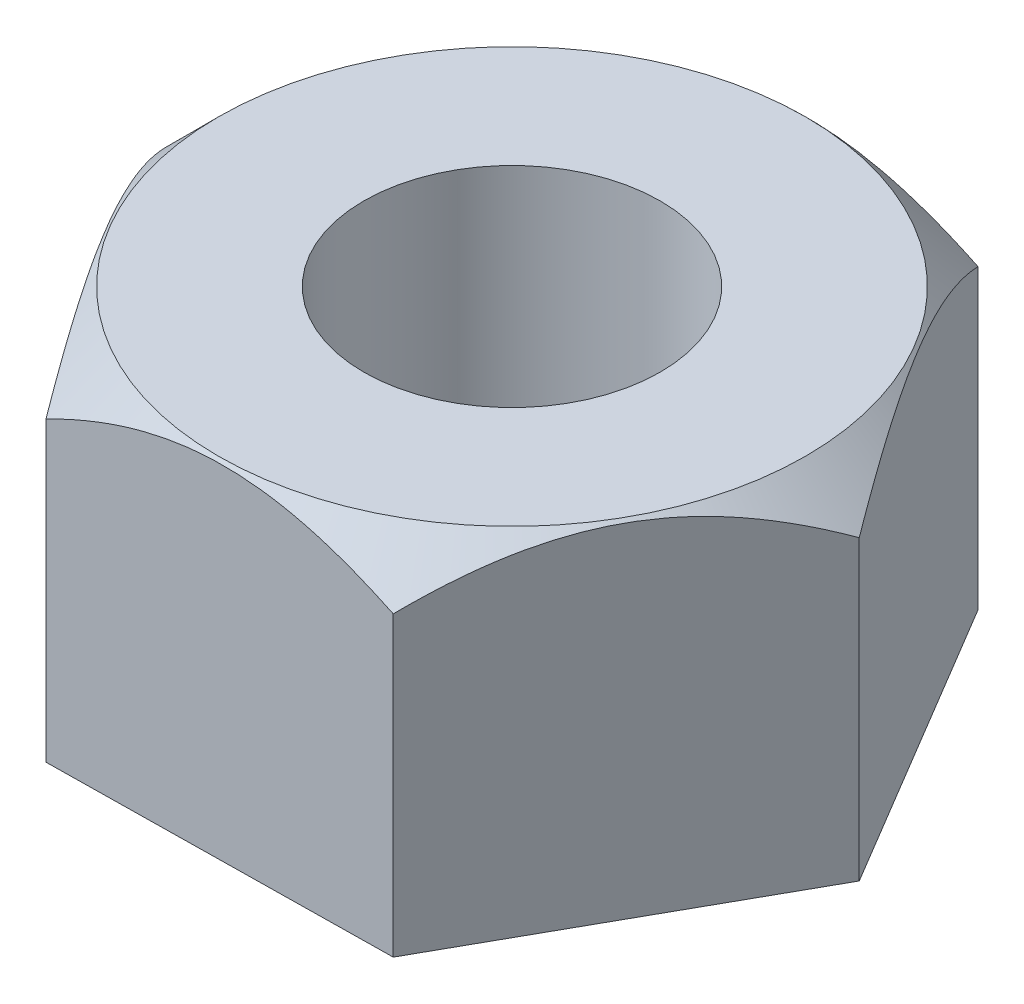
ISO-10303-21;
HEADER;
FILE_DESCRIPTION(('STEP AP214'),'2;1');
FILE_NAME('part.step','',(''),(''),'','','');
FILE_SCHEMA(('AUTOMOTIVE_DESIGN { 1 0 10303 214 1 1 1 1 }'));
ENDSEC;
DATA;
#1=APPLICATION_CONTEXT('core data for automotive mechanical design processes');
#2=APPLICATION_PROTOCOL_DEFINITION('international standard','automotive_design',2000,#1);
#3=PRODUCT_CONTEXT('',#1,'mechanical');
#4=PRODUCT('Part','Part','',(#3));
#5=PRODUCT_RELATED_PRODUCT_CATEGORY('part','',(#4));
#6=PRODUCT_DEFINITION_FORMATION('','',#4);
#7=PRODUCT_DEFINITION_CONTEXT('part definition',#1,'design');
#8=PRODUCT_DEFINITION('design','',#6,#7);
#9=PRODUCT_DEFINITION_SHAPE('','',#8);
#10=(LENGTH_UNIT() NAMED_UNIT(*) SI_UNIT(.MILLI.,.METRE.));
#11=(NAMED_UNIT(*) PLANE_ANGLE_UNIT() SI_UNIT($,.RADIAN.));
#12=(NAMED_UNIT(*) SI_UNIT($,.STERADIAN.) SOLID_ANGLE_UNIT());
#13=UNCERTAINTY_MEASURE_WITH_UNIT(LENGTH_MEASURE(1.E-05),#10,'distance_accuracy_value','');
#14=(GEOMETRIC_REPRESENTATION_CONTEXT(3) GLOBAL_UNCERTAINTY_ASSIGNED_CONTEXT((#13)) GLOBAL_UNIT_ASSIGNED_CONTEXT((#10,
#11,#12)) REPRESENTATION_CONTEXT('',''));
#15=CARTESIAN_POINT('',(0.,0.,0.));
#16=DIRECTION('',(0.,0.,1.));
#17=DIRECTION('',(1.,0.,0.));
#18=AXIS2_PLACEMENT_3D('',#15,#16,#17);
#19=CARTESIAN_POINT('',(-16.8965263921017,35.,30.2408233333851));
#20=DIRECTION('',(-0.0140755274986021,0.,-0.999900934855867));
#21=DIRECTION('',(-0.999900934855867,0.,0.0140755274986021));
#22=AXIS2_PLACEMENT_3D('',#19,#20,#21);
#23=PLANE('',#22);
#24=CARTESIAN_POINT('',(-16.8967263921017,30.0733528128783,30.2408261487695));
#25=CARTESIAN_POINT('',(-16.3012417337254,30.3710758383275,30.232443557663));
#26=CARTESIAN_POINT('',(-15.7010934883612,30.6597137270277,30.223995317606));
#27=CARTESIAN_POINT('',(-14.490744090219,31.2159334632379,30.2069573234982));
#28=CARTESIAN_POINT('',(-13.8805376643465,31.4835038119446,30.1983674952184));
#29=CARTESIAN_POINT('',(-12.6464682975278,31.9958357626679,30.180995596961));
#30=CARTESIAN_POINT('',(-12.0225471711405,32.2404580078834,30.1722127079114));
#31=CARTESIAN_POINT('',(-10.7644571516311,32.7015808484031,30.1545026727989));
#32=CARTESIAN_POINT('',(-10.1302898418968,32.9180857429419,30.1455755490252));
#33=CARTESIAN_POINT('',(-8.86195465153599,33.3161089993481,30.1277212934414));
#34=CARTESIAN_POINT('',(-8.22794336138656,33.4981236592763,30.1187963659433));
#35=CARTESIAN_POINT('',(-6.95092803981943,33.8276716741696,30.1008199208293));
#36=CARTESIAN_POINT('',(-6.30792356841713,33.9752033357815,30.0917683970198));
#37=CARTESIAN_POINT('',(-5.01584802272401,34.2320314171853,30.073579950305));
#38=CARTESIAN_POINT('',(-4.36679474528391,34.341416831023,30.0644432779246));
#39=CARTESIAN_POINT('',(-3.06315785900884,34.5195373561074,30.0460920831199));
#40=CARTESIAN_POINT('',(-2.40857509130723,34.5882785410107,30.0368775725362));
#41=CARTESIAN_POINT('',(-1.28298779414934,34.6696879114061,30.0210327679151));
#42=CARTESIAN_POINT('',(-0.812712187945846,34.6927426751118,30.0144127348735));
#43=CARTESIAN_POINT('',(0.128397389459291,34.7167164807198,30.0011648087299));
#44=CARTESIAN_POINT('',(0.599231333594301,34.7176365550372,29.9945369160088));
#45=CARTESIAN_POINT('',(1.54058427040297,34.6973189156047,29.9812855641137));
#46=CARTESIAN_POINT('',(2.01110308942099,34.6760732502631,29.9746621073844));
#47=CARTESIAN_POINT('',(2.95064787602284,34.6117402166292,29.9614362086788));
#48=CARTESIAN_POINT('',(3.41967381787342,34.5686524738672,29.9548337670649));
#49=CARTESIAN_POINT('',(4.3557609588433,34.4612214348156,29.9416565413673));
#50=CARTESIAN_POINT('',(4.82281965994384,34.3968564591848,29.9350817924481));
#51=CARTESIAN_POINT('',(5.75372089477773,34.2477844601109,29.9219775683468));
#52=CARTESIAN_POINT('',(6.21756305460481,34.1630751112109,29.9154480984283));
#53=CARTESIAN_POINT('',(7.14120843511876,33.9744504559985,29.9024460144226));
#54=CARTESIAN_POINT('',(7.60101252010505,33.8705393699783,29.8959733881688));
#55=CARTESIAN_POINT('',(8.51619890415774,33.6447412072004,29.8830903807967));
#56=CARTESIAN_POINT('',(8.97158084290303,33.5228526785055,29.8766800047507));
#57=CARTESIAN_POINT('',(10.1439451532646,33.1858305907987,29.8601767237619));
#58=CARTESIAN_POINT('',(10.8573023240414,32.9580113062111,29.8501348504887));
#59=CARTESIAN_POINT('',(12.2711298373565,32.4656876184971,29.8302325108186));
#60=CARTESIAN_POINT('',(12.9715997902385,32.201182108189,29.8203720499069));
#61=CARTESIAN_POINT('',(14.3575804559041,31.6413578284551,29.80086170814));
#62=CARTESIAN_POINT('',(15.0431304313584,31.3461359651212,29.7912112745872));
#63=CARTESIAN_POINT('',(16.0619796968487,30.8831568426234,29.7768690129156));
#64=CARTESIAN_POINT('',(16.399928522185,30.7255171939678,29.7721117336509));
#65=CARTESIAN_POINT('',(17.0728165784847,30.4039970834876,29.7626395409469));
#66=CARTESIAN_POINT('',(17.4077560250795,30.2401170732838,29.7579246244721));
#67=CARTESIAN_POINT('',(17.7412580420178,30.0733528128783,29.7532299425825));
#68=B_SPLINE_CURVE_WITH_KNOTS('',3,(#24,#25,#26,#27,#28,#29,#30,#31,#32,#33,#34,#35,#36,#37,#38,
#39,#40,#41,#42,#43,#44,#45,#46,#47,#48,#49,#50,#51,#52,#53,#54,#55,#56,#57,#58,#59,#60,#61,#62,
#63,#64,#65,#66,#67),.UNSPECIFIED.,.F.,.F.,(4,2,2,2,2,2,2,2,2,2,2,2,2,2,2,2,2,2,2,2,2,4),(0.,
1.99753332855272,3.99614947325625,6.00620823156275,8.01595928255441,9.99413044648933,
11.9723987318665,13.9460204068616,15.9193470797849,17.3315253047777,18.7436376622537,
20.1562567658751,21.5689000888557,22.9829872113905,24.3972360476788,25.8111744193603,
27.225227049503,29.4707461484645,31.7163330314216,33.9550386702232,35.0737986278815,
36.192477773146),.UNSPECIFIED.);
#69=CARTESIAN_POINT('',(-16.8965263921017,30.0734528232189,30.2408233333851));
#70=VERTEX_POINT('',#69);
#71=CARTESIAN_POINT('',(17.7410580420178,30.0734528232189,29.7532327579669));
#72=VERTEX_POINT('',#71);
#73=EDGE_CURVE('E91',#70,#72,#68,.T.);
#74=ORIENTED_EDGE('',*,*,#73,.F.);
#75=DIRECTION('',(0.,-1.,0.));
#76=VECTOR('',#75,1.);
#77=CARTESIAN_POINT('',(-16.8965263921017,35.,30.2408233333851));
#78=LINE('',#77,#76);
#79=CARTESIAN_POINT('',(-16.8965263921017,0.,30.2408233333851));
#80=VERTEX_POINT('',#79);
#81=EDGE_CURVE('E61',#70,#80,#78,.T.);
#82=ORIENTED_EDGE('',*,*,#81,.T.);
#83=DIRECTION('',(0.999900934855867,0.,-0.0140755274986021));
#84=VECTOR('',#83,1.);
#85=CARTESIAN_POINT('',(-16.8965263921017,0.,30.2408233333851));
#86=LINE('',#85,#84);
#87=CARTESIAN_POINT('',(17.7410580420178,0.,29.7532327579669));
#88=VERTEX_POINT('',#87);
#89=EDGE_CURVE('E131',#80,#88,#86,.T.);
#90=ORIENTED_EDGE('',*,*,#89,.T.);
#91=DIRECTION('',(0.,-1.,0.));
#92=VECTOR('',#91,1.);
#93=CARTESIAN_POINT('',(17.7410580420178,35.,29.7532327579669));
#94=LINE('',#93,#92);
#95=EDGE_CURVE('E12',#72,#88,#94,.T.);
#96=ORIENTED_EDGE('',*,*,#95,.F.);
#97=EDGE_LOOP('',(#74,#82,#90,#96));
#98=FACE_BOUND('',#97,.T.);
#99=ADVANCED_FACE('F38',(#98),#23,.F.);
#100=CARTESIAN_POINT('',(17.7410580420178,35.,29.7532327579669));
#101=DIRECTION('',(-0.872977374602291,0.,-0.487760703042478));
#102=DIRECTION('',(-0.487760703042478,0.,0.872977374602291));
#103=AXIS2_PLACEMENT_3D('',#100,#101,#102);
#104=PLANE('',#103);
#105=CARTESIAN_POINT('',(17.7409462955472,30.0733382721447,29.7534327579669));
#106=CARTESIAN_POINT('',(18.0314295154129,30.371062110346,29.2335358555255));
#107=CARTESIAN_POINT('',(18.3241876805629,30.6597008018401,28.7095673340521));
#108=CARTESIAN_POINT('',(18.9146079237605,31.2159221139609,27.6528534360204));
#109=CARTESIAN_POINT('',(19.2122725740859,31.4834932357338,27.1201034556875));
#110=CARTESIAN_POINT('',(19.8142636727009,31.9958267028122,26.042680437546));
#111=CARTESIAN_POINT('',(20.1186185046037,32.2404496903887,25.4979565997199));
#112=CARTESIAN_POINT('',(20.7323271395083,32.7015739572541,24.3995619370752));
#113=CARTESIAN_POINT('',(21.0416801701142,32.9180795357985,23.8458924946639));
#114=CARTESIAN_POINT('',(21.6603865021783,33.3161040613858,22.7385531250795));
#115=CARTESIAN_POINT('',(21.9696634167808,33.4981193096299,22.1850199124802));
#116=CARTESIAN_POINT('',(22.5926040053109,33.8276684122818,21.070102215921));
#117=CARTESIAN_POINT('',(22.9062678938688,33.9752005733252,20.5087173478231));
#118=CARTESIAN_POINT('',(23.536555027297,34.2320295421012,19.3806510572145));
#119=CARTESIAN_POINT('',(23.8531695906192,34.3414153445723,18.8139851726408));
#120=CARTESIAN_POINT('',(24.4890964765936,34.5195365208665,17.6758250463861));
#121=CARTESIAN_POINT('',(24.8084083889284,34.5882779684082,17.1043315390771));
#122=CARTESIAN_POINT('',(25.3574805856338,34.6696876160995,16.121620956291));
#123=CARTESIAN_POINT('',(25.586885291497,34.6927424629794,15.7110402830291));
#124=CARTESIAN_POINT('',(26.045967080578,34.7167164314874,14.8893914448596));
#125=CARTESIAN_POINT('',(26.2756441505922,34.717636585537,14.4783233035832));
#126=CARTESIAN_POINT('',(26.7348446564154,34.697319100869,13.6564619902607));
#127=CARTESIAN_POINT('',(26.964368007514,34.6760735105381,13.2456689698264));
#128=CARTESIAN_POINT('',(27.4226864848526,34.6117406211074,12.4253862808293));
#129=CARTESIAN_POINT('',(27.6514815985396,34.5686529475355,12.0158966347335));
#130=CARTESIAN_POINT('',(28.1081134094179,34.4612220399397,11.1986326835093));
#131=CARTESIAN_POINT('',(28.3359488880465,34.3968571264283,10.7908605593225));
#132=CARTESIAN_POINT('',(28.7900509706783,34.2477852441752,9.97812422893626));
#133=CARTESIAN_POINT('',(29.0163173922868,34.1630759499766,9.57316034918049));
#134=CARTESIAN_POINT('',(29.4668800050822,33.9744513964994,8.76675884049284));
#135=CARTESIAN_POINT('',(29.6911766178816,33.8705403575122,8.36532045697304));
#136=CARTESIAN_POINT('',(30.1376128566341,33.644742281236,7.56630419099986));
#137=CARTESIAN_POINT('',(30.3597523068183,33.5228537920017,7.16872662313144));
#138=CARTESIAN_POINT('',(30.9316436749823,33.185830973153,6.14517507003714));
#139=CARTESIAN_POINT('',(31.2796271640056,32.9580107448315,5.52236615829495));
#140=CARTESIAN_POINT('',(31.9693077801912,32.4656848808394,4.28799944962755));
#141=CARTESIAN_POINT('',(32.3110047172455,32.201178137811,3.6764419929513));
#142=CARTESIAN_POINT('',(32.9871012870056,31.6413511662024,2.46638754460143));
#143=CARTESIAN_POINT('',(33.3215200725022,31.3461278441646,1.86785627391992));
#144=CARTESIAN_POINT('',(33.8185258828883,30.8831464029996,0.97833232332985));
#145=CARTESIAN_POINT('',(33.983381010558,30.7255059607804,0.68328027086821));
#146=CARTESIAN_POINT('',(34.3116231476127,30.4039842243877,0.0958037536898502));
#147=CARTESIAN_POINT('',(34.4750102621866,30.2401033818427,-0.196620899290252));
#148=CARTESIAN_POINT('',(34.6376961805903,30.0733382721447,-0.487790575418247));
#149=B_SPLINE_CURVE_WITH_KNOTS('',3,(#105,#106,#107,#108,#109,#110,#111,#112,#113,#114,#115,
#116,#117,#118,#119,#120,#121,#122,#123,#124,#125,#126,#127,#128,#129,#130,#131,#132,#133,#134,
#135,#136,#137,#138,#139,#140,#141,#142,#143,#144,#145,#146,#147,#148),.UNSPECIFIED.,.F.,.F.,(4,
2,2,2,2,2,2,2,2,2,2,2,2,2,2,2,2,2,2,2,2,4),(0.,1.99753677134283,3.99615636389893,
6.00621864636324,8.01597322012988,9.99414772625386,11.972419354385,13.9460443414354,
15.9193743238228,17.3315526812136,18.7436651706898,20.1562844076223,21.5689278640544,
22.9830151294544,24.3972641085643,25.8112026232287,27.2252553969619,29.4707836670239,
31.7163797316034,33.9550945415454,35.0738590707961,36.1925427864669),.UNSPECIFIED.);
#150=CARTESIAN_POINT('',(34.6375844341196,30.0734528232189,-0.487590575418245));
#151=VERTEX_POINT('',#150);
#152=EDGE_CURVE('E99',#72,#151,#149,.T.);
#153=ORIENTED_EDGE('',*,*,#152,.F.);
#154=ORIENTED_EDGE('',*,*,#95,.T.);
#155=DIRECTION('',(0.487760703042478,0.,-0.872977374602291));
#156=VECTOR('',#155,1.);
#157=CARTESIAN_POINT('',(17.7410580420178,0.,29.7532327579669));
#158=LINE('',#157,#156);
#159=CARTESIAN_POINT('',(34.6375844341196,0.,-0.487590575418245));
#160=VERTEX_POINT('',#159);
#161=EDGE_CURVE('E128',#88,#160,#158,.T.);
#162=ORIENTED_EDGE('',*,*,#161,.T.);
#163=DIRECTION('',(0.,-1.,0.));
#164=VECTOR('',#163,1.);
#165=CARTESIAN_POINT('',(34.6375844341196,35.,-0.487590575418245));
#166=LINE('',#165,#164);
#167=EDGE_CURVE('E46',#151,#160,#166,.T.);
#168=ORIENTED_EDGE('',*,*,#167,.F.);
#169=EDGE_LOOP('',(#153,#154,#162,#168));
#170=FACE_BOUND('',#169,.T.);
#171=ADVANCED_FACE('F129',(#170),#104,.F.);
#172=CARTESIAN_POINT('',(34.6375844341196,35.,-0.487590575418245));
#173=DIRECTION('',(-0.858901847103688,0.,0.512140231813389));
#174=DIRECTION('',(0.512140231813389,0.,0.858901847103688));
#175=AXIS2_PLACEMENT_3D('',#172,#173,#174);
#176=PLANE('',#175);
#177=CARTESIAN_POINT('',(34.637703688778,30.0733363948931,-0.487390575418246));
#178=CARTESIAN_POINT('',(34.3327013158942,30.3710603380231,-0.998904971608786));
#179=CARTESIAN_POINT('',(34.0253102893975,30.6596991331603,-1.51442533896257));
#180=CARTESIAN_POINT('',(33.4053792114994,31.215920648736,-2.55410141752087));
#181=CARTESIAN_POINT('',(33.092836459249,31.483491870314,-3.07826165827399));
#182=CARTESIAN_POINT('',(32.460756179457,31.9958255331585,-4.1383129608419));
#183=CARTESIAN_POINT('',(32.1411888495851,32.2404486165761,-4.67425400364781));
#184=CARTESIAN_POINT('',(31.496805354932,32.701573067587,-5.75493882280561));
#185=CARTESIAN_POINT('',(31.1719900011535,32.9180787344385,-6.2996812390383));
#186=CARTESIAN_POINT('',(30.5223590102413,33.316103423881,-7.38916654671398));
#187=CARTESIAN_POINT('',(30.1976235780562,33.4981187480784,-7.93377492777439));
#188=CARTESIAN_POINT('',(29.5435466903295,33.8276679911631,-9.0307163748993));
#189=CARTESIAN_POINT('',(29.2142050094297,33.9752002166847,-9.58304981890841));
#190=CARTESIAN_POINT('',(28.5524143733967,34.2320293000229,-10.6929278647553));
#191=CARTESIAN_POINT('',(28.2199745337491,34.3414151526677,-11.2504571791643));
#192=CARTESIAN_POINT('',(27.5522622523417,34.5195364130349,-12.3702663177747));
#193=CARTESIAN_POINT('',(27.2169902414087,34.5882778944839,-12.9325454194435));
#194=CARTESIAN_POINT('',(26.640473935749,34.6696875779748,-13.8994113070603));
#195=CARTESIAN_POINT('',(26.3996029926828,34.6927424355926,-14.3033719511609));
#196=CARTESIAN_POINT('',(25.9175751148252,34.7167164251313,-15.1117728713179));
#197=CARTESIAN_POINT('',(25.6764181938974,34.7176365894745,-15.516213124124));
#198=CARTESIAN_POINT('',(25.1942656650119,34.6973191247868,-16.3248230944424));
#199=CARTESIAN_POINT('',(24.9532701459986,34.6760735441399,-16.7289926627875));
#200=CARTESIAN_POINT('',(24.4720437311638,34.6117406733261,-17.5360494626666));
#201=CARTESIAN_POINT('',(24.2318128485227,34.5686530086868,-17.938936672096));
#202=CARTESIAN_POINT('',(23.7523574034743,34.4612221180621,-18.7430234080626));
#203=CARTESIAN_POINT('',(23.5131341205374,34.3968572125705,-19.1442207888213));
#204=CARTESIAN_POINT('',(23.0363348455443,34.247785345399,-19.9438529062577));
#205=CARTESIAN_POINT('',(22.7987590449992,34.1630760582624,-20.3422873217552));
#206=CARTESIAN_POINT('',(22.3256761514166,33.9744515179194,-21.1356867578676));
#207=CARTESIAN_POINT('',(22.0901686156932,33.8705404850041,-21.5306525209037));
#208=CARTESIAN_POINT('',(21.6214183427849,33.6447424198954,-22.3167857910937));
#209=CARTESIAN_POINT('',(21.3881757901543,33.5228539357555,-22.7079529887347));
#210=CARTESIAN_POINT('',(20.7876996274236,33.1858310225142,-23.7150015533143));
#211=CARTESIAN_POINT('',(20.4223228400399,32.958010672354,-24.3277688738223));
#212=CARTESIAN_POINT('',(19.6981698424678,32.4656845273982,-25.5422337968338));
#213=CARTESIAN_POINT('',(19.3393938318937,32.2011776252221,-26.1439310645674));
#214=CARTESIAN_POINT('',(18.6295038600947,31.6413503060849,-27.3344757047719));
#215=CARTESIAN_POINT('',(18.2783697887592,31.3461267957243,-27.9233568035741));
#216=CARTESIAN_POINT('',(17.756522092408,30.8831450552127,-28.7985388776631));
#217=CARTESIAN_POINT('',(17.5834269966578,30.7255045105423,-29.0888337778276));
#218=CARTESIAN_POINT('',(17.238778305241,30.4039825642397,-29.6668383540577));
#219=CARTESIAN_POINT('',(17.0672245991278,30.2401016142371,-29.9545482153518));
#220=CARTESIAN_POINT('',(16.8964071374433,30.0733363948931,-30.2410233333851));
#221=B_SPLINE_CURVE_WITH_KNOTS('',3,(#177,#178,#179,#180,#181,#182,#183,#184,#185,#186,#187,
#188,#189,#190,#191,#192,#193,#194,#195,#196,#197,#198,#199,#200,#201,#202,#203,#204,#205,#206,
#207,#208,#209,#210,#211,#212,#213,#214,#215,#216,#217,#218,#219,#220),.UNSPECIFIED.,.F.,.F.,(4,
2,2,2,2,2,2,2,2,2,2,2,2,2,2,2,2,2,2,2,2,4),(0.,1.99753721581763,3.99615725350212,
6.00621999094608,8.01597501951383,9.99414995712467,11.9724220168156,13.9460474314625,
15.9193778411119,17.3315562155958,18.7436687221137,20.1562879762573,21.5689314499186,
22.983018733763,24.3972677313118,25.8112062644359,27.2252590567072,29.470788510783,
31.7163857607348,33.9551017546957,35.0738668741513,36.1925511798739),.UNSPECIFIED.);
#222=CARTESIAN_POINT('',(16.8965263921017,30.0734528232189,-30.2408233333851));
#223=VERTEX_POINT('',#222);
#224=EDGE_CURVE('E125',#151,#223,#221,.T.);
#225=ORIENTED_EDGE('',*,*,#224,.F.);
#226=ORIENTED_EDGE('',*,*,#167,.T.);
#227=DIRECTION('',(-0.512140231813389,0.,-0.858901847103688));
#228=VECTOR('',#227,1.);
#229=CARTESIAN_POINT('',(34.6375844341196,0.,-0.487590575418245));
#230=LINE('',#229,#228);
#231=CARTESIAN_POINT('',(16.8965263921017,0.,-30.2408233333851));
#232=VERTEX_POINT('',#231);
#233=EDGE_CURVE('E123',#160,#232,#230,.T.);
#234=ORIENTED_EDGE('',*,*,#233,.T.);
#235=DIRECTION('',(0.,-1.,0.));
#236=VECTOR('',#235,1.);
#237=CARTESIAN_POINT('',(16.8965263921017,35.,-30.2408233333851));
#238=LINE('',#237,#236);
#239=EDGE_CURVE('E114',#223,#232,#238,.T.);
#240=ORIENTED_EDGE('',*,*,#239,.F.);
#241=EDGE_LOOP('',(#225,#226,#234,#240));
#242=FACE_BOUND('',#241,.T.);
#243=ADVANCED_FACE('F120',(#242),#176,.F.);
#244=CARTESIAN_POINT('',(16.8965263921017,35.,-30.2408233333851));
#245=DIRECTION('',(0.0140755274986024,0.,0.999900934855867));
#246=DIRECTION('',(0.999900934855867,0.,-0.0140755274986024));
#247=AXIS2_PLACEMENT_3D('',#244,#245,#246);
#248=PLANE('',#247);
#249=CARTESIAN_POINT('',(16.8967263921017,30.0733528128783,-30.2408261487695));
#250=CARTESIAN_POINT('',(16.3012417337254,30.3710758383274,-30.232443557663));
#251=CARTESIAN_POINT('',(15.7010934883612,30.6597137270277,-30.223995317606));
#252=CARTESIAN_POINT('',(14.490744090219,31.2159334632379,-30.2069573234982));
#253=CARTESIAN_POINT('',(13.8805376643465,31.4835038119446,-30.1983674952184));
#254=CARTESIAN_POINT('',(12.6464682975278,31.9958357626679,-30.180995596961));
#255=CARTESIAN_POINT('',(12.0225471711405,32.2404580078834,-30.1722127079114));
#256=CARTESIAN_POINT('',(10.7644571516311,32.7015808484031,-30.1545026727989));
#257=CARTESIAN_POINT('',(10.1302898418968,32.9180857429419,-30.1455755490252));
#258=CARTESIAN_POINT('',(8.86195465153599,33.3161089993481,-30.1277212934414));
#259=CARTESIAN_POINT('',(8.22794336138657,33.4981236592763,-30.1187963659433));
#260=CARTESIAN_POINT('',(6.95092803981943,33.8276716741696,-30.1008199208293));
#261=CARTESIAN_POINT('',(6.30792356841713,33.9752033357815,-30.0917683970198));
#262=CARTESIAN_POINT('',(5.015848022724,34.2320314171853,-30.0735799503051));
#263=CARTESIAN_POINT('',(4.36679474528391,34.341416831023,-30.0644432779246));
#264=CARTESIAN_POINT('',(3.06315785900884,34.5195373561074,-30.0460920831199));
#265=CARTESIAN_POINT('',(2.40857509130723,34.5882785410107,-30.0368775725362));
#266=CARTESIAN_POINT('',(1.28298779414933,34.6696879114061,-30.0210327679151));
#267=CARTESIAN_POINT('',(0.812712187945841,34.6927426751118,-30.0144127348735));
#268=CARTESIAN_POINT('',(-0.128397389459296,34.7167164807198,-30.0011648087299));
#269=CARTESIAN_POINT('',(-0.599231333594307,34.7176365550372,-29.9945369160088));
#270=CARTESIAN_POINT('',(-1.54058427040297,34.6973189156047,-29.9812855641137));
#271=CARTESIAN_POINT('',(-2.01110308942099,34.6760732502631,-29.9746621073844));
#272=CARTESIAN_POINT('',(-2.95064787602284,34.6117402166292,-29.9614362086788));
#273=CARTESIAN_POINT('',(-3.41967381787343,34.5686524738672,-29.9548337670649));
#274=CARTESIAN_POINT('',(-4.3557609588433,34.4612214348156,-29.9416565413673));
#275=CARTESIAN_POINT('',(-4.82281965994386,34.3968564591848,-29.9350817924481));
#276=CARTESIAN_POINT('',(-5.75372089477774,34.2477844601109,-29.9219775683468));
#277=CARTESIAN_POINT('',(-6.21756305460482,34.1630751112109,-29.9154480984283));
#278=CARTESIAN_POINT('',(-7.14120843511877,33.9744504559985,-29.9024460144226));
#279=CARTESIAN_POINT('',(-7.60101252010506,33.8705393699783,-29.8959733881688));
#280=CARTESIAN_POINT('',(-8.51619890415775,33.6447412072004,-29.8830903807967));
#281=CARTESIAN_POINT('',(-8.97158084290304,33.5228526785055,-29.8766800047507));
#282=CARTESIAN_POINT('',(-10.1439451532646,33.1858305907987,-29.8601767237619));
#283=CARTESIAN_POINT('',(-10.8573023240415,32.9580113062111,-29.8501348504887));
#284=CARTESIAN_POINT('',(-12.2711298373565,32.4656876184971,-29.8302325108186));
#285=CARTESIAN_POINT('',(-12.9715997902385,32.2011821081891,-29.8203720499069));
#286=CARTESIAN_POINT('',(-14.3575804559041,31.6413578284551,-29.8008617081399));
#287=CARTESIAN_POINT('',(-15.0431304313584,31.3461359651212,-29.7912112745872));
#288=CARTESIAN_POINT('',(-16.0619796968487,30.8831568426234,-29.7768690129156));
#289=CARTESIAN_POINT('',(-16.399928522185,30.7255171939678,-29.7721117336509));
#290=CARTESIAN_POINT('',(-17.0728165784847,30.4039970834876,-29.7626395409469));
#291=CARTESIAN_POINT('',(-17.4077560250795,30.2401170732838,-29.7579246244721));
#292=CARTESIAN_POINT('',(-17.7412580420178,30.0733528128783,-29.7532299425825));
#293=B_SPLINE_CURVE_WITH_KNOTS('',3,(#249,#250,#251,#252,#253,#254,#255,#256,#257,#258,#259,
#260,#261,#262,#263,#264,#265,#266,#267,#268,#269,#270,#271,#272,#273,#274,#275,#276,#277,#278,
#279,#280,#281,#282,#283,#284,#285,#286,#287,#288,#289,#290,#291,#292),.UNSPECIFIED.,.F.,.F.,(4,
2,2,2,2,2,2,2,2,2,2,2,2,2,2,2,2,2,2,2,2,4),(0.,1.99753332855272,3.99614947325626,
6.00620823156275,8.01595928255441,9.99413044648933,11.9723987318665,13.9460204068616,
15.9193470797849,17.3315253047777,18.7436376622538,20.1562567658751,21.5689000888558,
22.9829872113905,24.3972360476788,25.8111744193604,27.2252270495031,29.4707461484645,
31.7163330314216,33.9550386702232,35.0737986278815,36.192477773146),.UNSPECIFIED.);
#294=CARTESIAN_POINT('',(-17.7410580420178,30.0734528232189,-29.7532327579669));
#295=VERTEX_POINT('',#294);
#296=EDGE_CURVE('E184',#223,#295,#293,.T.);
#297=ORIENTED_EDGE('',*,*,#296,.F.);
#298=ORIENTED_EDGE('',*,*,#239,.T.);
#299=DIRECTION('',(-0.999900934855867,0.,0.0140755274986024));
#300=VECTOR('',#299,1.);
#301=CARTESIAN_POINT('',(16.8965263921017,0.,-30.2408233333851));
#302=LINE('',#301,#300);
#303=CARTESIAN_POINT('',(-17.7410580420178,0.,-29.7532327579669));
#304=VERTEX_POINT('',#303);
#305=EDGE_CURVE('E136',#232,#304,#302,.T.);
#306=ORIENTED_EDGE('',*,*,#305,.T.);
#307=DIRECTION('',(0.,-1.,0.));
#308=VECTOR('',#307,1.);
#309=CARTESIAN_POINT('',(-17.7410580420178,35.,-29.7532327579669));
#310=LINE('',#309,#308);
#311=EDGE_CURVE('E107',#295,#304,#310,.T.);
#312=ORIENTED_EDGE('',*,*,#311,.F.);
#313=EDGE_LOOP('',(#297,#298,#306,#312));
#314=FACE_BOUND('',#313,.T.);
#315=ADVANCED_FACE('F197',(#314),#248,.F.);
#316=CARTESIAN_POINT('',(-17.7410580420178,35.,-29.7532327579669));
#317=DIRECTION('',(0.872977374602291,0.,0.487760703042478));
#318=DIRECTION('',(0.487760703042478,0.,-0.87297737460229));
#319=AXIS2_PLACEMENT_3D('',#316,#317,#318);
#320=PLANE('',#319);
#321=CARTESIAN_POINT('',(-17.7409462955471,30.0733382721447,-29.7534327579669));
#322=CARTESIAN_POINT('',(-18.0314295154129,30.371062110346,-29.2335358555255));
#323=CARTESIAN_POINT('',(-18.3241876805628,30.6597008018401,-28.7095673340521));
#324=CARTESIAN_POINT('',(-18.9146079237605,31.2159221139609,-27.6528534360204));
#325=CARTESIAN_POINT('',(-19.2122725740859,31.4834932357338,-27.1201034556875));
#326=CARTESIAN_POINT('',(-19.8142636727009,31.9958267028122,-26.042680437546));
#327=CARTESIAN_POINT('',(-20.1186185046037,32.2404496903887,-25.4979565997199));
#328=CARTESIAN_POINT('',(-20.7323271395083,32.7015739572541,-24.3995619370751));
#329=CARTESIAN_POINT('',(-21.0416801701142,32.9180795357985,-23.8458924946639));
#330=CARTESIAN_POINT('',(-21.6603865021783,33.3161040613858,-22.7385531250794));
#331=CARTESIAN_POINT('',(-21.9696634167808,33.4981193096299,-22.1850199124802));
#332=CARTESIAN_POINT('',(-22.5926040053109,33.8276684122818,-21.070102215921));
#333=CARTESIAN_POINT('',(-22.9062678938688,33.9752005733253,-20.5087173478231));
#334=CARTESIAN_POINT('',(-23.536555027297,34.2320295421012,-19.3806510572145));
#335=CARTESIAN_POINT('',(-23.8531695906192,34.3414153445723,-18.8139851726408));
#336=CARTESIAN_POINT('',(-24.4890964765936,34.5195365208665,-17.6758250463861));
#337=CARTESIAN_POINT('',(-24.8084083889284,34.5882779684082,-17.1043315390771));
#338=CARTESIAN_POINT('',(-25.3574805856338,34.6696876160995,-16.121620956291));
#339=CARTESIAN_POINT('',(-25.586885291497,34.6927424629794,-15.7110402830291));
#340=CARTESIAN_POINT('',(-26.045967080578,34.7167164314874,-14.8893914448596));
#341=CARTESIAN_POINT('',(-26.2756441505922,34.717636585537,-14.4783233035832));
#342=CARTESIAN_POINT('',(-26.7348446564153,34.697319100869,-13.6564619902607));
#343=CARTESIAN_POINT('',(-26.964368007514,34.6760735105381,-13.2456689698264));
#344=CARTESIAN_POINT('',(-27.4226864848526,34.6117406211074,-12.4253862808293));
#345=CARTESIAN_POINT('',(-27.6514815985396,34.5686529475355,-12.0158966347335));
#346=CARTESIAN_POINT('',(-28.1081134094179,34.4612220399397,-11.1986326835093));
#347=CARTESIAN_POINT('',(-28.3359488880465,34.3968571264283,-10.7908605593225));
#348=CARTESIAN_POINT('',(-28.7900509706783,34.2477852441752,-9.97812422893626));
#349=CARTESIAN_POINT('',(-29.0163173922868,34.1630759499766,-9.57316034918049));
#350=CARTESIAN_POINT('',(-29.4668800050822,33.9744513964994,-8.76675884049284));
#351=CARTESIAN_POINT('',(-29.6911766178816,33.8705403575122,-8.36532045697304));
#352=CARTESIAN_POINT('',(-30.1376128566341,33.644742281236,-7.56630419099986));
#353=CARTESIAN_POINT('',(-30.3597523068183,33.5228537920017,-7.16872662313144));
#354=CARTESIAN_POINT('',(-30.9316436749823,33.185830973153,-6.14517507003715));
#355=CARTESIAN_POINT('',(-31.2796271640056,32.9580107448315,-5.52236615829496));
#356=CARTESIAN_POINT('',(-31.9693077801912,32.4656848808394,-4.28799944962756));
#357=CARTESIAN_POINT('',(-32.3110047172455,32.201178137811,-3.67644199295131));
#358=CARTESIAN_POINT('',(-32.9871012870056,31.6413511662024,-2.46638754460144));
#359=CARTESIAN_POINT('',(-33.3215200725022,31.3461278441646,-1.86785627391993));
#360=CARTESIAN_POINT('',(-33.8185258828883,30.8831464029996,-0.978332323329857));
#361=CARTESIAN_POINT('',(-33.983381010558,30.7255059607804,-0.683280270868218));
#362=CARTESIAN_POINT('',(-34.3116231476127,30.4039842243877,-0.0958037536898571));
#363=CARTESIAN_POINT('',(-34.4750102621866,30.2401033818427,0.196620899290245));
#364=CARTESIAN_POINT('',(-34.6376961805903,30.0733382721447,0.48779057541824));
#365=B_SPLINE_CURVE_WITH_KNOTS('',3,(#321,#322,#323,#324,#325,#326,#327,#328,#329,#330,#331,
#332,#333,#334,#335,#336,#337,#338,#339,#340,#341,#342,#343,#344,#345,#346,#347,#348,#349,#350,
#351,#352,#353,#354,#355,#356,#357,#358,#359,#360,#361,#362,#363,#364),.UNSPECIFIED.,.F.,.F.,(4,
2,2,2,2,2,2,2,2,2,2,2,2,2,2,2,2,2,2,2,2,4),(0.,1.99753677134283,3.99615636389893,
6.00621864636324,8.01597322012988,9.99414772625387,11.972419354385,13.9460443414354,
15.9193743238228,17.3315526812136,18.7436651706898,20.1562844076223,21.5689278640544,
22.9830151294544,24.3972641085643,25.8112026232287,27.2252553969619,29.4707836670239,
31.7163797316034,33.9550945415454,35.0738590707961,36.1925427864669),.UNSPECIFIED.);
#366=CARTESIAN_POINT('',(-34.6375844341196,30.0734528232189,0.487590575418237));
#367=VERTEX_POINT('',#366);
#368=EDGE_CURVE('E53',#295,#367,#365,.T.);
#369=ORIENTED_EDGE('',*,*,#368,.F.);
#370=ORIENTED_EDGE('',*,*,#311,.T.);
#371=DIRECTION('',(-0.487760703042478,0.,0.87297737460229));
#372=VECTOR('',#371,1.);
#373=CARTESIAN_POINT('',(-17.7410580420178,0.,-29.7532327579669));
#374=LINE('',#373,#372);
#375=CARTESIAN_POINT('',(-34.6375844341196,0.,0.487590575418237));
#376=VERTEX_POINT('',#375);
#377=EDGE_CURVE('E109',#304,#376,#374,.T.);
#378=ORIENTED_EDGE('',*,*,#377,.T.);
#379=DIRECTION('',(0.,-1.,0.));
#380=VECTOR('',#379,1.);
#381=CARTESIAN_POINT('',(-34.6375844341196,35.,0.487590575418237));
#382=LINE('',#381,#380);
#383=EDGE_CURVE('E105',#367,#376,#382,.T.);
#384=ORIENTED_EDGE('',*,*,#383,.F.);
#385=EDGE_LOOP('',(#369,#370,#378,#384));
#386=FACE_BOUND('',#385,.T.);
#387=ADVANCED_FACE('F142',(#386),#320,.F.);
#388=CARTESIAN_POINT('',(-34.6375844341196,35.,0.487590575418237));
#389=DIRECTION('',(0.858901847103688,0.,-0.51214023181339));
#390=DIRECTION('',(-0.51214023181339,0.,-0.858901847103688));
#391=AXIS2_PLACEMENT_3D('',#388,#389,#390);
#392=PLANE('',#391);
#393=CARTESIAN_POINT('',(-34.637703688778,30.073336394893,0.487390575418237));
#394=CARTESIAN_POINT('',(-34.3327013158942,30.3710603380231,0.998904971608777));
#395=CARTESIAN_POINT('',(-34.0253102893975,30.6596991331603,1.51442533896256));
#396=CARTESIAN_POINT('',(-33.4053792114994,31.215920648736,2.55410141752086));
#397=CARTESIAN_POINT('',(-33.0928364592491,31.483491870314,3.07826165827398));
#398=CARTESIAN_POINT('',(-32.460756179457,31.9958255331585,4.1383129608419));
#399=CARTESIAN_POINT('',(-32.1411888495851,32.2404486165761,4.6742540036478));
#400=CARTESIAN_POINT('',(-31.496805354932,32.701573067587,5.75493882280561));
#401=CARTESIAN_POINT('',(-31.1719900011535,32.9180787344385,6.29968123903829));
#402=CARTESIAN_POINT('',(-30.5223590102413,33.316103423881,7.38916654671397));
#403=CARTESIAN_POINT('',(-30.1976235780562,33.4981187480784,7.93377492777439));
#404=CARTESIAN_POINT('',(-29.5435466903295,33.8276679911631,9.0307163748993));
#405=CARTESIAN_POINT('',(-29.2142050094297,33.9752002166847,9.58304981890841));
#406=CARTESIAN_POINT('',(-28.5524143733967,34.2320293000229,10.6929278647553));
#407=CARTESIAN_POINT('',(-28.2199745337491,34.3414151526677,11.2504571791643));
#408=CARTESIAN_POINT('',(-27.5522622523417,34.5195364130349,12.3702663177747));
#409=CARTESIAN_POINT('',(-27.2169902414087,34.5882778944839,12.9325454194435));
#410=CARTESIAN_POINT('',(-26.640473935749,34.6696875779748,13.8994113070603));
#411=CARTESIAN_POINT('',(-26.3996029926828,34.6927424355926,14.3033719511609));
#412=CARTESIAN_POINT('',(-25.9175751148252,34.7167164251313,15.1117728713179));
#413=CARTESIAN_POINT('',(-25.6764181938973,34.7176365894745,15.516213124124));
#414=CARTESIAN_POINT('',(-25.1942656650119,34.6973191247868,16.3248230944424));
#415=CARTESIAN_POINT('',(-24.9532701459986,34.6760735441399,16.7289926627875));
#416=CARTESIAN_POINT('',(-24.4720437311638,34.6117406733261,17.5360494626666));
#417=CARTESIAN_POINT('',(-24.2318128485227,34.5686530086868,17.938936672096));
#418=CARTESIAN_POINT('',(-23.7523574034743,34.4612221180621,18.7430234080626));
#419=CARTESIAN_POINT('',(-23.5131341205374,34.3968572125705,19.1442207888213));
#420=CARTESIAN_POINT('',(-23.0363348455443,34.247785345399,19.9438529062577));
#421=CARTESIAN_POINT('',(-22.7987590449992,34.1630760582624,20.3422873217552));
#422=CARTESIAN_POINT('',(-22.3256761514166,33.9744515179194,21.1356867578676));
#423=CARTESIAN_POINT('',(-22.0901686156932,33.8705404850041,21.5306525209037));
#424=CARTESIAN_POINT('',(-21.6214183427849,33.6447424198954,22.3167857910937));
#425=CARTESIAN_POINT('',(-21.3881757901543,33.5228539357555,22.7079529887347));
#426=CARTESIAN_POINT('',(-20.7876996274235,33.1858310225142,23.7150015533143));
#427=CARTESIAN_POINT('',(-20.4223228400399,32.958010672354,24.3277688738223));
#428=CARTESIAN_POINT('',(-19.6981698424678,32.4656845273982,25.5422337968338));
#429=CARTESIAN_POINT('',(-19.3393938318937,32.2011776252222,26.1439310645674));
#430=CARTESIAN_POINT('',(-18.6295038600947,31.6413503060849,27.3344757047719));
#431=CARTESIAN_POINT('',(-18.2783697887592,31.3461267957243,27.9233568035741));
#432=CARTESIAN_POINT('',(-17.756522092408,30.8831450552128,28.7985388776631));
#433=CARTESIAN_POINT('',(-17.5834269966578,30.7255045105423,29.0888337778276));
#434=CARTESIAN_POINT('',(-17.238778305241,30.4039825642398,29.6668383540577));
#435=CARTESIAN_POINT('',(-17.0672245991278,30.2401016142371,29.9545482153517));
#436=CARTESIAN_POINT('',(-16.8964071374433,30.0733363948931,30.2410233333851));
#437=B_SPLINE_CURVE_WITH_KNOTS('',3,(#393,#394,#395,#396,#397,#398,#399,#400,#401,#402,#403,
#404,#405,#406,#407,#408,#409,#410,#411,#412,#413,#414,#415,#416,#417,#418,#419,#420,#421,#422,
#423,#424,#425,#426,#427,#428,#429,#430,#431,#432,#433,#434,#435,#436),.UNSPECIFIED.,.F.,.F.,(4,
2,2,2,2,2,2,2,2,2,2,2,2,2,2,2,2,2,2,2,2,4),(0.,1.99753721581764,3.99615725350212,
6.00621999094608,8.01597501951383,9.99414995712469,11.9724220168156,13.9460474314625,
15.9193778411119,17.3315562155958,18.7436687221137,20.1562879762573,21.5689314499186,
22.983018733763,24.3972677313118,25.8112062644359,27.2252590567072,29.470788510783,
31.7163857607348,33.9551017546957,35.0738668741513,36.1925511798739),.UNSPECIFIED.);
#438=EDGE_CURVE('E89',#367,#70,#437,.T.);
#439=ORIENTED_EDGE('',*,*,#438,.F.);
#440=ORIENTED_EDGE('',*,*,#383,.T.);
#441=DIRECTION('',(0.51214023181339,0.,0.858901847103688));
#442=VECTOR('',#441,1.);
#443=CARTESIAN_POINT('',(-34.6375844341196,0.,0.487590575418237));
#444=LINE('',#443,#442);
#445=EDGE_CURVE('E103',#376,#80,#444,.T.);
#446=ORIENTED_EDGE('',*,*,#445,.T.);
#447=ORIENTED_EDGE('',*,*,#81,.F.);
#448=EDGE_LOOP('',(#439,#440,#446,#447));
#449=FACE_BOUND('',#448,.T.);
#450=ADVANCED_FACE('F101',(#449),#392,.F.);
#451=CARTESIAN_POINT('',(0.,35.,0.));
#452=DIRECTION('',(0.,1.,0.));
#453=DIRECTION('',(0.,0.,1.));
#454=AXIS2_PLACEMENT_3D('',#451,#452,#453);
#455=PLANE('',#454);
#456=CARTESIAN_POINT('',(0.,35.,0.));
#457=DIRECTION('',(0.,1.,0.));
#458=DIRECTION('',(0.,0.,1.));
#459=AXIS2_PLACEMENT_3D('',#456,#457,#458);
#460=CIRCLE('',#459,15.);
#461=CARTESIAN_POINT('',(0.,35.,15.));
#462=VERTEX_POINT('',#461);
#463=EDGE_CURVE('E98',#462,#462,#460,.T.);
#464=ORIENTED_EDGE('',*,*,#463,.F.);
#465=EDGE_LOOP('',(#464));
#466=FACE_BOUND('',#465,.T.);
#467=CARTESIAN_POINT('',(0.,35.,0.));
#468=DIRECTION('',(0.,1.,0.));
#469=DIRECTION('',(0.,0.,1.));
#470=AXIS2_PLACEMENT_3D('',#467,#468,#469);
#471=CIRCLE('',#470,29.7144689745965);
#472=CARTESIAN_POINT('',(0.,35.,29.7144689745965));
#473=VERTEX_POINT('',#472);
#474=EDGE_CURVE('E95',#473,#473,#471,.T.);
#475=ORIENTED_EDGE('',*,*,#474,.T.);
#476=EDGE_LOOP('',(#475));
#477=FACE_BOUND('',#476,.T.);
#478=ADVANCED_FACE('F246',(#466,#477),#455,.T.);
#479=CARTESIAN_POINT('',(0.,0.,0.));
#480=DIRECTION('',(0.,1.,0.));
#481=DIRECTION('',(0.,0.,1.));
#482=AXIS2_PLACEMENT_3D('',#479,#480,#481);
#483=PLANE('',#482);
#484=CARTESIAN_POINT('',(0.,0.,0.));
#485=DIRECTION('',(0.,1.,0.));
#486=DIRECTION('',(0.,0.,1.));
#487=AXIS2_PLACEMENT_3D('',#484,#485,#486);
#488=CIRCLE('',#487,15.);
#489=CARTESIAN_POINT('',(0.,0.,15.));
#490=VERTEX_POINT('',#489);
#491=EDGE_CURVE('E144',#490,#490,#488,.T.);
#492=ORIENTED_EDGE('',*,*,#491,.T.);
#493=EDGE_LOOP('',(#492));
#494=FACE_BOUND('',#493,.T.);
#495=ORIENTED_EDGE('',*,*,#89,.F.);
#496=ORIENTED_EDGE('',*,*,#445,.F.);
#497=ORIENTED_EDGE('',*,*,#377,.F.);
#498=ORIENTED_EDGE('',*,*,#305,.F.);
#499=ORIENTED_EDGE('',*,*,#233,.F.);
#500=ORIENTED_EDGE('',*,*,#161,.F.);
#501=EDGE_LOOP('',(#495,#496,#497,#498,#499,#500));
#502=FACE_BOUND('',#501,.T.);
#503=ADVANCED_FACE('F133',(#494,#502),#483,.F.);
#504=CARTESIAN_POINT('',(0.,0.,0.));
#505=DIRECTION('',(0.,1.,0.));
#506=DIRECTION('',(0.,0.,1.));
#507=AXIS2_PLACEMENT_3D('',#504,#505,#506);
#508=CYLINDRICAL_SURFACE('',#507,15.);
#509=ORIENTED_EDGE('',*,*,#491,.F.);
#510=EDGE_LOOP('',(#509));
#511=FACE_BOUND('',#510,.T.);
#512=ORIENTED_EDGE('',*,*,#463,.T.);
#513=EDGE_LOOP('',(#512));
#514=FACE_BOUND('',#513,.T.);
#515=ADVANCED_FACE('F163',(#511,#514),#508,.F.);
#516=CARTESIAN_POINT('',(0.,35.,0.));
#517=DIRECTION('',(0.,-1.,0.));
#518=DIRECTION('',(0.,0.,1.));
#519=AXIS2_PLACEMENT_3D('',#516,#517,#518);
#520=CONICAL_SURFACE('',#519,29.7144689745965,0.78539816339745);
#521=ORIENTED_EDGE('',*,*,#474,.F.);
#522=EDGE_LOOP('',(#521));
#523=FACE_BOUND('',#522,.T.);
#524=ORIENTED_EDGE('',*,*,#73,.T.);
#525=ORIENTED_EDGE('',*,*,#152,.T.);
#526=ORIENTED_EDGE('',*,*,#224,.T.);
#527=ORIENTED_EDGE('',*,*,#296,.T.);
#528=ORIENTED_EDGE('',*,*,#368,.T.);
#529=ORIENTED_EDGE('',*,*,#438,.T.);
#530=EDGE_LOOP('',(#524,#525,#526,#527,#528,#529));
#531=FACE_BOUND('',#530,.T.);
#532=ADVANCED_FACE('F90',(#523,#531),#520,.T.);
#533=CLOSED_SHELL('',(#99,#171,#243,#315,#387,#450,#478,#503,#515,#532));
#534=MANIFOLD_SOLID_BREP('B2',#533);
#535=ADVANCED_BREP_SHAPE_REPRESENTATION('',(#18,#534),#14);
#536=SHAPE_DEFINITION_REPRESENTATION(#9,#535);
ENDSEC;
END-ISO-10303-21;
